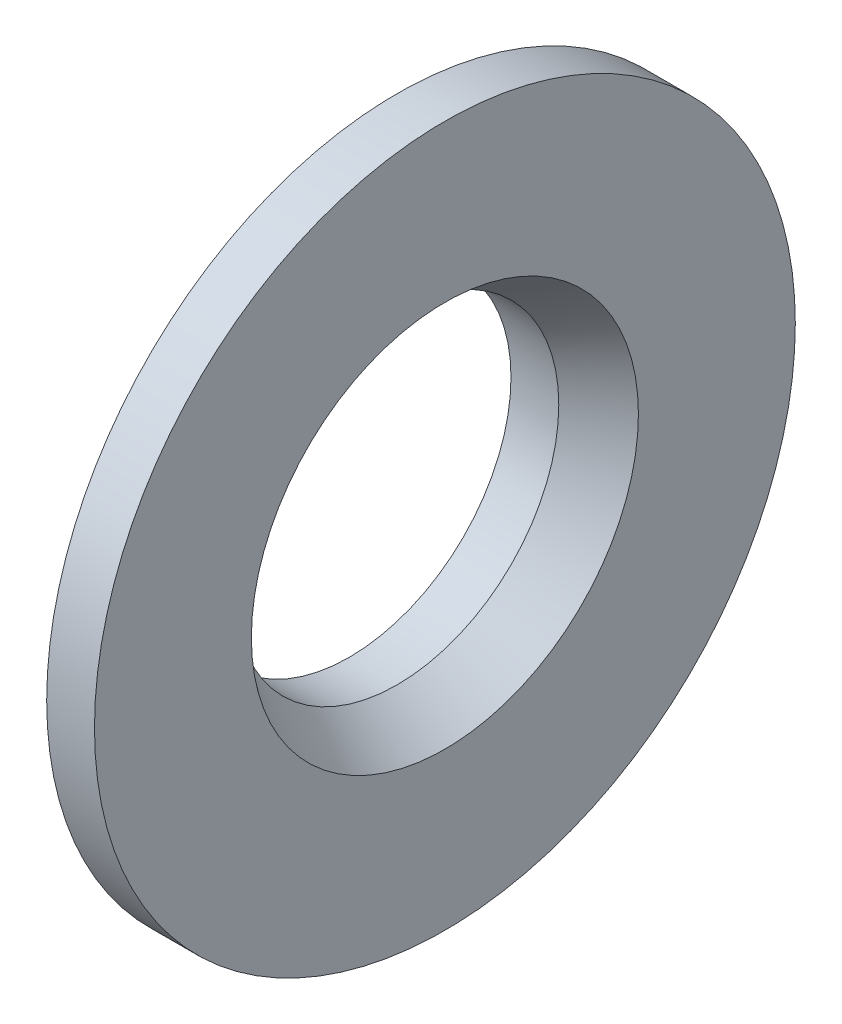
ISO-10303-21;
HEADER;
FILE_DESCRIPTION(('STEP AP214'),'2;1');
FILE_NAME('part.step','',(''),(''),'','','');
FILE_SCHEMA(('AUTOMOTIVE_DESIGN { 1 0 10303 214 1 1 1 1 }'));
ENDSEC;
DATA;
#1=APPLICATION_CONTEXT('core data for automotive mechanical design processes');
#2=APPLICATION_PROTOCOL_DEFINITION('international standard','automotive_design',2000,#1);
#3=PRODUCT_CONTEXT('',#1,'mechanical');
#4=PRODUCT('Part','Part','',(#3));
#5=PRODUCT_RELATED_PRODUCT_CATEGORY('part','',(#4));
#6=PRODUCT_DEFINITION_FORMATION('','',#4);
#7=PRODUCT_DEFINITION_CONTEXT('part definition',#1,'design');
#8=PRODUCT_DEFINITION('design','',#6,#7);
#9=PRODUCT_DEFINITION_SHAPE('','',#8);
#10=(LENGTH_UNIT() NAMED_UNIT(*) SI_UNIT(.MILLI.,.METRE.));
#11=(NAMED_UNIT(*) PLANE_ANGLE_UNIT() SI_UNIT($,.RADIAN.));
#12=(NAMED_UNIT(*) SI_UNIT($,.STERADIAN.) SOLID_ANGLE_UNIT());
#13=UNCERTAINTY_MEASURE_WITH_UNIT(LENGTH_MEASURE(1.E-05),#10,'distance_accuracy_value','');
#14=(GEOMETRIC_REPRESENTATION_CONTEXT(3) GLOBAL_UNCERTAINTY_ASSIGNED_CONTEXT((#13)) GLOBAL_UNIT_ASSIGNED_CONTEXT((#10,
#11,#12)) REPRESENTATION_CONTEXT('',''));
#15=CARTESIAN_POINT('',(0.,0.,0.));
#16=DIRECTION('',(0.,0.,1.));
#17=DIRECTION('',(1.,0.,0.));
#18=AXIS2_PLACEMENT_3D('',#15,#16,#17);
#19=CARTESIAN_POINT('',(3.,22.,0.));
#20=DIRECTION('',(1.,0.,0.));
#21=DIRECTION('',(0.,0.,-1.));
#22=AXIS2_PLACEMENT_3D('',#19,#20,#21);
#23=PLANE('',#22);
#24=CARTESIAN_POINT('',(3.,0.,0.));
#25=DIRECTION('',(-1.,0.,0.));
#26=DIRECTION('',(0.,0.,1.));
#27=AXIS2_PLACEMENT_3D('',#24,#25,#26);
#28=CIRCLE('',#27,15.);
#29=CARTESIAN_POINT('',(3.,0.,15.));
#30=VERTEX_POINT('',#29);
#31=EDGE_CURVE('E10',#30,#30,#28,.T.);
#32=ORIENTED_EDGE('',*,*,#31,.F.);
#33=EDGE_LOOP('',(#32));
#34=FACE_BOUND('',#33,.T.);
#35=CARTESIAN_POINT('',(3.,0.,0.));
#36=DIRECTION('',(-1.,0.,0.));
#37=DIRECTION('',(0.,0.,1.));
#38=AXIS2_PLACEMENT_3D('',#35,#36,#37);
#39=CIRCLE('',#38,22.);
#40=CARTESIAN_POINT('',(3.,0.,22.));
#41=VERTEX_POINT('',#40);
#42=EDGE_CURVE('E74',#41,#41,#39,.T.);
#43=ORIENTED_EDGE('',*,*,#42,.T.);
#44=EDGE_LOOP('',(#43));
#45=FACE_BOUND('',#44,.T.);
#46=ADVANCED_FACE('F43',(#34,#45),#23,.F.);
#47=CARTESIAN_POINT('',(3.,0.,0.));
#48=DIRECTION('',(1.,0.,0.));
#49=DIRECTION('',(0.,0.,-1.));
#50=AXIS2_PLACEMENT_3D('',#47,#48,#49);
#51=CONICAL_SURFACE('',#50,15.,0.588002603547568);
#52=CARTESIAN_POINT('',(0.,0.,0.));
#53=DIRECTION('',(-1.,0.,0.));
#54=DIRECTION('',(0.,0.,1.));
#55=AXIS2_PLACEMENT_3D('',#52,#53,#54);
#56=CIRCLE('',#55,13.);
#57=CARTESIAN_POINT('',(0.,0.,13.));
#58=VERTEX_POINT('',#57);
#59=EDGE_CURVE('E50',#58,#58,#56,.T.);
#60=ORIENTED_EDGE('',*,*,#59,.F.);
#61=EDGE_LOOP('',(#60));
#62=FACE_BOUND('',#61,.T.);
#63=ORIENTED_EDGE('',*,*,#31,.T.);
#64=EDGE_LOOP('',(#63));
#65=FACE_BOUND('',#64,.T.);
#66=ADVANCED_FACE('F106',(#62,#65),#51,.T.);
#67=CARTESIAN_POINT('',(0.,13.,0.));
#68=DIRECTION('',(1.,0.,0.));
#69=DIRECTION('',(0.,0.,-1.));
#70=AXIS2_PLACEMENT_3D('',#67,#68,#69);
#71=PLANE('',#70);
#72=CARTESIAN_POINT('',(0.,0.,0.));
#73=DIRECTION('',(-1.,0.,0.));
#74=DIRECTION('',(0.,0.,1.));
#75=AXIS2_PLACEMENT_3D('',#72,#73,#74);
#76=CIRCLE('',#75,10.15);
#77=CARTESIAN_POINT('',(0.,0.,10.15));
#78=VERTEX_POINT('',#77);
#79=EDGE_CURVE('E55',#78,#78,#76,.T.);
#80=ORIENTED_EDGE('',*,*,#79,.F.);
#81=EDGE_LOOP('',(#80));
#82=FACE_BOUND('',#81,.T.);
#83=ORIENTED_EDGE('',*,*,#59,.T.);
#84=EDGE_LOOP('',(#83));
#85=FACE_BOUND('',#84,.T.);
#86=ADVANCED_FACE('F101',(#82,#85),#71,.F.);
#87=CARTESIAN_POINT('',(0.,0.,0.));
#88=DIRECTION('',(-1.,0.,0.));
#89=DIRECTION('',(0.,0.,1.));
#90=AXIS2_PLACEMENT_3D('',#87,#88,#89);
#91=CYLINDRICAL_SURFACE('',#90,10.15);
#92=CARTESIAN_POINT('',(3.,0.,0.));
#93=DIRECTION('',(-1.,0.,0.));
#94=DIRECTION('',(0.,0.,1.));
#95=AXIS2_PLACEMENT_3D('',#92,#93,#94);
#96=CIRCLE('',#95,10.15);
#97=CARTESIAN_POINT('',(3.,0.,10.15));
#98=VERTEX_POINT('',#97);
#99=EDGE_CURVE('E60',#98,#98,#96,.T.);
#100=ORIENTED_EDGE('',*,*,#99,.F.);
#101=EDGE_LOOP('',(#100));
#102=FACE_BOUND('',#101,.T.);
#103=ORIENTED_EDGE('',*,*,#79,.T.);
#104=EDGE_LOOP('',(#103));
#105=FACE_BOUND('',#104,.T.);
#106=ADVANCED_FACE('F95',(#102,#105),#91,.F.);
#107=CARTESIAN_POINT('',(3.,0.,0.));
#108=DIRECTION('',(1.,0.,0.));
#109=DIRECTION('',(0.,0.,-1.));
#110=AXIS2_PLACEMENT_3D('',#107,#108,#109);
#111=CONICAL_SURFACE('',#110,10.15,0.588002603547567);
#112=CARTESIAN_POINT('',(6.,0.,0.));
#113=DIRECTION('',(-1.,0.,0.));
#114=DIRECTION('',(0.,0.,1.));
#115=AXIS2_PLACEMENT_3D('',#112,#113,#114);
#116=CIRCLE('',#115,12.15);
#117=CARTESIAN_POINT('',(6.,0.,12.15));
#118=VERTEX_POINT('',#117);
#119=EDGE_CURVE('E66',#118,#118,#116,.T.);
#120=ORIENTED_EDGE('',*,*,#119,.F.);
#121=EDGE_LOOP('',(#120));
#122=FACE_BOUND('',#121,.T.);
#123=ORIENTED_EDGE('',*,*,#99,.T.);
#124=EDGE_LOOP('',(#123));
#125=FACE_BOUND('',#124,.T.);
#126=ADVANCED_FACE('F89',(#122,#125),#111,.F.);
#127=CARTESIAN_POINT('',(6.,12.15,0.));
#128=DIRECTION('',(-1.,0.,0.));
#129=DIRECTION('',(0.,0.,1.));
#130=AXIS2_PLACEMENT_3D('',#127,#128,#129);
#131=PLANE('',#130);
#132=CARTESIAN_POINT('',(6.,0.,0.));
#133=DIRECTION('',(-1.,0.,0.));
#134=DIRECTION('',(0.,0.,1.));
#135=AXIS2_PLACEMENT_3D('',#132,#133,#134);
#136=CIRCLE('',#135,22.);
#137=CARTESIAN_POINT('',(6.,0.,22.));
#138=VERTEX_POINT('',#137);
#139=EDGE_CURVE('E70',#138,#138,#136,.T.);
#140=ORIENTED_EDGE('',*,*,#139,.F.);
#141=EDGE_LOOP('',(#140));
#142=FACE_BOUND('',#141,.T.);
#143=ORIENTED_EDGE('',*,*,#119,.T.);
#144=EDGE_LOOP('',(#143));
#145=FACE_BOUND('',#144,.T.);
#146=ADVANCED_FACE('F83',(#142,#145),#131,.F.);
#147=CARTESIAN_POINT('',(0.,0.,0.));
#148=DIRECTION('',(-1.,0.,0.));
#149=DIRECTION('',(0.,0.,1.));
#150=AXIS2_PLACEMENT_3D('',#147,#148,#149);
#151=CYLINDRICAL_SURFACE('',#150,22.);
#152=ORIENTED_EDGE('',*,*,#42,.F.);
#153=EDGE_LOOP('',(#152));
#154=FACE_BOUND('',#153,.T.);
#155=ORIENTED_EDGE('',*,*,#139,.T.);
#156=EDGE_LOOP('',(#155));
#157=FACE_BOUND('',#156,.T.);
#158=ADVANCED_FACE('F80',(#154,#157),#151,.T.);
#159=CLOSED_SHELL('',(#46,#66,#86,#106,#126,#146,#158));
#160=MANIFOLD_SOLID_BREP('B2',#159);
#161=ADVANCED_BREP_SHAPE_REPRESENTATION('',(#18,#160),#14);
#162=SHAPE_DEFINITION_REPRESENTATION(#9,#161);
ENDSEC;
END-ISO-10303-21;
